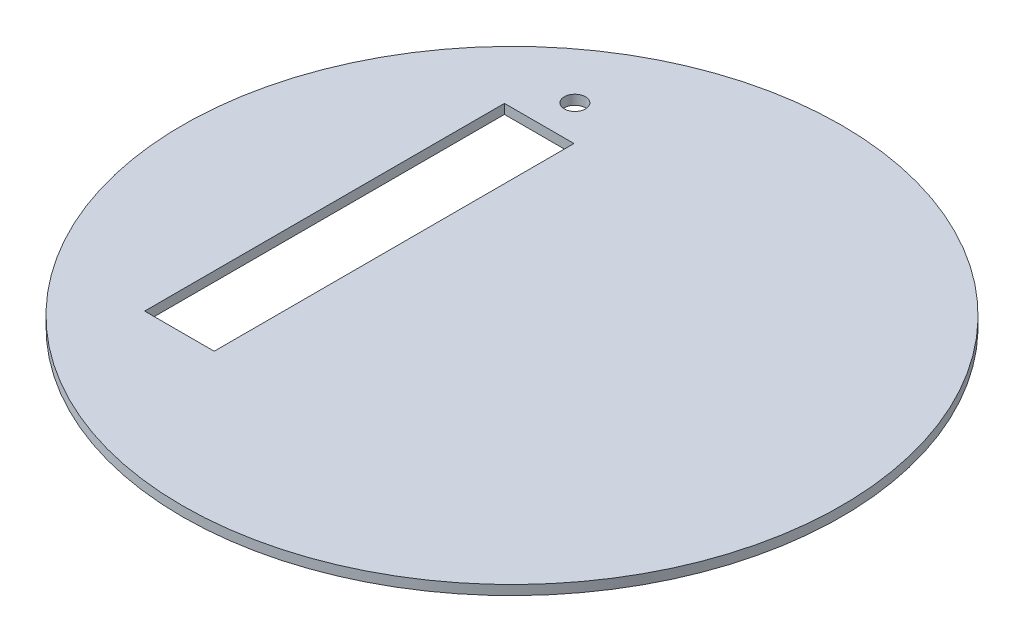
ISO-10303-21;
HEADER;
FILE_DESCRIPTION(('STEP AP214'),'2;1');
FILE_NAME('part.step','',(''),(''),'','','');
FILE_SCHEMA(('AUTOMOTIVE_DESIGN { 1 0 10303 214 1 1 1 1 }'));
ENDSEC;
DATA;
#1=APPLICATION_CONTEXT('core data for automotive mechanical design processes');
#2=APPLICATION_PROTOCOL_DEFINITION('international standard','automotive_design',2000,#1);
#3=PRODUCT_CONTEXT('',#1,'mechanical');
#4=PRODUCT('Part','Part','',(#3));
#5=PRODUCT_RELATED_PRODUCT_CATEGORY('part','',(#4));
#6=PRODUCT_DEFINITION_FORMATION('','',#4);
#7=PRODUCT_DEFINITION_CONTEXT('part definition',#1,'design');
#8=PRODUCT_DEFINITION('design','',#6,#7);
#9=PRODUCT_DEFINITION_SHAPE('','',#8);
#10=(LENGTH_UNIT() NAMED_UNIT(*) SI_UNIT(.MILLI.,.METRE.));
#11=(NAMED_UNIT(*) PLANE_ANGLE_UNIT() SI_UNIT($,.RADIAN.));
#12=(NAMED_UNIT(*) SI_UNIT($,.STERADIAN.) SOLID_ANGLE_UNIT());
#13=UNCERTAINTY_MEASURE_WITH_UNIT(LENGTH_MEASURE(1.E-05),#10,'distance_accuracy_value','');
#14=(GEOMETRIC_REPRESENTATION_CONTEXT(3) GLOBAL_UNCERTAINTY_ASSIGNED_CONTEXT((#13)) GLOBAL_UNIT_ASSIGNED_CONTEXT((#10,
#11,#12)) REPRESENTATION_CONTEXT('',''));
#15=CARTESIAN_POINT('',(0.,0.,0.));
#16=DIRECTION('',(0.,0.,1.));
#17=DIRECTION('',(1.,0.,0.));
#18=AXIS2_PLACEMENT_3D('',#15,#16,#17);
#19=CARTESIAN_POINT('',(0.,3.18,0.));
#20=DIRECTION('',(0.,1.,0.));
#21=DIRECTION('',(0.,0.,1.));
#22=AXIS2_PLACEMENT_3D('',#19,#20,#21);
#23=PLANE('',#22);
#24=CARTESIAN_POINT('',(-50.5,3.18,-71.3022378857318));
#25=DIRECTION('',(0.,1.,0.));
#26=DIRECTION('',(0.,0.,1.));
#27=AXIS2_PLACEMENT_3D('',#24,#25,#26);
#28=CIRCLE('',#27,3.5);
#29=CARTESIAN_POINT('',(-50.5,3.18,-67.8022378857318));
#30=VERTEX_POINT('',#29);
#31=EDGE_CURVE('E101',#30,#30,#28,.T.);
#32=ORIENTED_EDGE('',*,*,#31,.F.);
#33=EDGE_LOOP('',(#32));
#34=FACE_BOUND('',#33,.T.);
#35=DIRECTION('',(0.,0.,1.));
#36=VECTOR('',#35,1.);
#37=CARTESIAN_POINT('',(-62.,3.18,59.5));
#38=LINE('',#37,#36);
#39=CARTESIAN_POINT('',(-62.,3.18,-59.5));
#40=VERTEX_POINT('',#39);
#41=CARTESIAN_POINT('',(-62.,3.18,59.5));
#42=VERTEX_POINT('',#41);
#43=EDGE_CURVE('E51',#40,#42,#38,.T.);
#44=ORIENTED_EDGE('',*,*,#43,.F.);
#45=DIRECTION('',(-1.,0.,0.));
#46=VECTOR('',#45,1.);
#47=CARTESIAN_POINT('',(-39.,3.18,-59.5));
#48=LINE('',#47,#46);
#49=CARTESIAN_POINT('',(-39.,3.18,-59.5));
#50=VERTEX_POINT('',#49);
#51=EDGE_CURVE('E95',#50,#40,#48,.T.);
#52=ORIENTED_EDGE('',*,*,#51,.F.);
#53=DIRECTION('',(0.,0.,-1.));
#54=VECTOR('',#53,1.);
#55=CARTESIAN_POINT('',(-39.,3.18,59.5));
#56=LINE('',#55,#54);
#57=CARTESIAN_POINT('',(-39.,3.18,59.5));
#58=VERTEX_POINT('',#57);
#59=EDGE_CURVE('E98',#58,#50,#56,.T.);
#60=ORIENTED_EDGE('',*,*,#59,.F.);
#61=DIRECTION('',(1.,0.,0.));
#62=VECTOR('',#61,1.);
#63=CARTESIAN_POINT('',(-39.,3.18,59.5));
#64=LINE('',#63,#62);
#65=EDGE_CURVE('E107',#42,#58,#64,.T.);
#66=ORIENTED_EDGE('',*,*,#65,.F.);
#67=EDGE_LOOP('',(#44,#52,#60,#66));
#68=FACE_BOUND('',#67,.T.);
#69=CARTESIAN_POINT('',(0.,3.18,0.));
#70=DIRECTION('',(0.,-1.,0.));
#71=DIRECTION('',(0.,0.,-1.));
#72=AXIS2_PLACEMENT_3D('',#69,#70,#71);
#73=CIRCLE('',#72,109.);
#74=CARTESIAN_POINT('',(0.,3.18,-109.));
#75=VERTEX_POINT('',#74);
#76=EDGE_CURVE('E11',#75,#75,#73,.T.);
#77=ORIENTED_EDGE('',*,*,#76,.F.);
#78=EDGE_LOOP('',(#77));
#79=FACE_BOUND('',#78,.T.);
#80=ADVANCED_FACE('F37',(#34,#68,#79),#23,.T.);
#81=CARTESIAN_POINT('',(0.,4.51102530553271,0.));
#82=DIRECTION('',(0.,-1.,0.));
#83=DIRECTION('',(0.,0.,-1.));
#84=AXIS2_PLACEMENT_3D('',#81,#82,#83);
#85=CYLINDRICAL_SURFACE('',#84,109.);
#86=ORIENTED_EDGE('',*,*,#76,.T.);
#87=EDGE_LOOP('',(#86));
#88=FACE_BOUND('',#87,.T.);
#89=CARTESIAN_POINT('',(0.,0.,0.));
#90=DIRECTION('',(0.,-1.,0.));
#91=DIRECTION('',(0.,0.,-1.));
#92=AXIS2_PLACEMENT_3D('',#89,#90,#91);
#93=CIRCLE('',#92,109.);
#94=CARTESIAN_POINT('',(0.,0.,-109.));
#95=VERTEX_POINT('',#94);
#96=EDGE_CURVE('E44',#95,#95,#93,.T.);
#97=ORIENTED_EDGE('',*,*,#96,.F.);
#98=EDGE_LOOP('',(#97));
#99=FACE_BOUND('',#98,.T.);
#100=ADVANCED_FACE('F119',(#88,#99),#85,.T.);
#101=CARTESIAN_POINT('',(109.,0.,0.));
#102=DIRECTION('',(0.,-1.,0.));
#103=DIRECTION('',(0.,0.,-1.));
#104=AXIS2_PLACEMENT_3D('',#101,#102,#103);
#105=PLANE('',#104);
#106=CARTESIAN_POINT('',(-50.5,0.,-71.3022378857318));
#107=DIRECTION('',(0.,1.,0.));
#108=DIRECTION('',(0.,0.,1.));
#109=AXIS2_PLACEMENT_3D('',#106,#107,#108);
#110=CIRCLE('',#109,3.5);
#111=CARTESIAN_POINT('',(-50.5,0.,-67.8022378857318));
#112=VERTEX_POINT('',#111);
#113=EDGE_CURVE('E108',#112,#112,#110,.T.);
#114=ORIENTED_EDGE('',*,*,#113,.T.);
#115=EDGE_LOOP('',(#114));
#116=FACE_BOUND('',#115,.T.);
#117=DIRECTION('',(0.,0.,1.));
#118=VECTOR('',#117,1.);
#119=CARTESIAN_POINT('',(-62.,0.,59.5));
#120=LINE('',#119,#118);
#121=CARTESIAN_POINT('',(-62.,0.,-59.5));
#122=VERTEX_POINT('',#121);
#123=CARTESIAN_POINT('',(-62.,0.,59.5));
#124=VERTEX_POINT('',#123);
#125=EDGE_CURVE('E79',#122,#124,#120,.T.);
#126=ORIENTED_EDGE('',*,*,#125,.T.);
#127=DIRECTION('',(1.,0.,0.));
#128=VECTOR('',#127,1.);
#129=CARTESIAN_POINT('',(-39.,0.,59.5));
#130=LINE('',#129,#128);
#131=CARTESIAN_POINT('',(-39.,0.,59.5));
#132=VERTEX_POINT('',#131);
#133=EDGE_CURVE('E88',#124,#132,#130,.T.);
#134=ORIENTED_EDGE('',*,*,#133,.T.);
#135=DIRECTION('',(0.,0.,-1.));
#136=VECTOR('',#135,1.);
#137=CARTESIAN_POINT('',(-39.,0.,59.5));
#138=LINE('',#137,#136);
#139=CARTESIAN_POINT('',(-39.,0.,-59.5));
#140=VERTEX_POINT('',#139);
#141=EDGE_CURVE('E59',#132,#140,#138,.T.);
#142=ORIENTED_EDGE('',*,*,#141,.T.);
#143=DIRECTION('',(-1.,0.,0.));
#144=VECTOR('',#143,1.);
#145=CARTESIAN_POINT('',(-39.,0.,-59.5));
#146=LINE('',#145,#144);
#147=EDGE_CURVE('E85',#140,#122,#146,.T.);
#148=ORIENTED_EDGE('',*,*,#147,.T.);
#149=EDGE_LOOP('',(#126,#134,#142,#148));
#150=FACE_BOUND('',#149,.T.);
#151=ORIENTED_EDGE('',*,*,#96,.T.);
#152=EDGE_LOOP('',(#151));
#153=FACE_BOUND('',#152,.T.);
#154=ADVANCED_FACE('F92',(#116,#150,#153),#105,.T.);
#155=CARTESIAN_POINT('',(-62.,0.,59.5));
#156=DIRECTION('',(-1.,0.,0.));
#157=DIRECTION('',(0.,0.,1.));
#158=AXIS2_PLACEMENT_3D('',#155,#156,#157);
#159=PLANE('',#158);
#160=ORIENTED_EDGE('',*,*,#43,.T.);
#161=DIRECTION('',(0.,1.,0.));
#162=VECTOR('',#161,1.);
#163=CARTESIAN_POINT('',(-62.,0.,59.5));
#164=LINE('',#163,#162);
#165=EDGE_CURVE('E75',#124,#42,#164,.T.);
#166=ORIENTED_EDGE('',*,*,#165,.F.);
#167=ORIENTED_EDGE('',*,*,#125,.F.);
#168=DIRECTION('',(0.,1.,0.));
#169=VECTOR('',#168,1.);
#170=CARTESIAN_POINT('',(-62.,0.,-59.5));
#171=LINE('',#170,#169);
#172=EDGE_CURVE('E112',#122,#40,#171,.T.);
#173=ORIENTED_EDGE('',*,*,#172,.T.);
#174=EDGE_LOOP('',(#160,#166,#167,#173));
#175=FACE_BOUND('',#174,.T.);
#176=ADVANCED_FACE('F77',(#175),#159,.F.);
#177=CARTESIAN_POINT('',(-39.,0.,-59.5));
#178=DIRECTION('',(0.,0.,-1.));
#179=DIRECTION('',(-1.,0.,0.));
#180=AXIS2_PLACEMENT_3D('',#177,#178,#179);
#181=PLANE('',#180);
#182=ORIENTED_EDGE('',*,*,#51,.T.);
#183=ORIENTED_EDGE('',*,*,#172,.F.);
#184=ORIENTED_EDGE('',*,*,#147,.F.);
#185=DIRECTION('',(0.,1.,0.));
#186=VECTOR('',#185,1.);
#187=CARTESIAN_POINT('',(-39.,0.,-59.5));
#188=LINE('',#187,#186);
#189=EDGE_CURVE('E114',#140,#50,#188,.T.);
#190=ORIENTED_EDGE('',*,*,#189,.T.);
#191=EDGE_LOOP('',(#182,#183,#184,#190));
#192=FACE_BOUND('',#191,.T.);
#193=ADVANCED_FACE('F132',(#192),#181,.F.);
#194=CARTESIAN_POINT('',(-39.,0.,59.5));
#195=DIRECTION('',(1.,0.,0.));
#196=DIRECTION('',(0.,0.,-1.));
#197=AXIS2_PLACEMENT_3D('',#194,#195,#196);
#198=PLANE('',#197);
#199=ORIENTED_EDGE('',*,*,#59,.T.);
#200=ORIENTED_EDGE('',*,*,#189,.F.);
#201=ORIENTED_EDGE('',*,*,#141,.F.);
#202=DIRECTION('',(0.,1.,0.));
#203=VECTOR('',#202,1.);
#204=CARTESIAN_POINT('',(-39.,0.,59.5));
#205=LINE('',#204,#203);
#206=EDGE_CURVE('E84',#132,#58,#205,.T.);
#207=ORIENTED_EDGE('',*,*,#206,.T.);
#208=EDGE_LOOP('',(#199,#200,#201,#207));
#209=FACE_BOUND('',#208,.T.);
#210=ADVANCED_FACE('F136',(#209),#198,.F.);
#211=CARTESIAN_POINT('',(-39.,0.,59.5));
#212=DIRECTION('',(0.,0.,1.));
#213=DIRECTION('',(1.,0.,0.));
#214=AXIS2_PLACEMENT_3D('',#211,#212,#213);
#215=PLANE('',#214);
#216=ORIENTED_EDGE('',*,*,#65,.T.);
#217=ORIENTED_EDGE('',*,*,#206,.F.);
#218=ORIENTED_EDGE('',*,*,#133,.F.);
#219=ORIENTED_EDGE('',*,*,#165,.T.);
#220=EDGE_LOOP('',(#216,#217,#218,#219));
#221=FACE_BOUND('',#220,.T.);
#222=ADVANCED_FACE('F89',(#221),#215,.F.);
#223=CARTESIAN_POINT('',(-50.5,0.,-71.3022378857318));
#224=DIRECTION('',(0.,1.,0.));
#225=DIRECTION('',(0.,0.,1.));
#226=AXIS2_PLACEMENT_3D('',#223,#224,#225);
#227=CYLINDRICAL_SURFACE('',#226,3.5);
#228=CARTESIAN_POINT('',(-50.5,0.,-67.8022378857318));
#229=CARTESIAN_POINT('',(-50.5,0.033125,-67.8022378857318));
#230=CARTESIAN_POINT('',(-50.5,0.06625,-67.8022378857318));
#231=CARTESIAN_POINT('',(-50.5,0.1325,-67.8022378857318));
#232=CARTESIAN_POINT('',(-50.5,0.165625,-67.8022378857318));
#233=CARTESIAN_POINT('',(-50.5,0.231875,-67.8022378857318));
#234=CARTESIAN_POINT('',(-50.5,0.265,-67.8022378857318));
#235=CARTESIAN_POINT('',(-50.5,0.33125,-67.8022378857318));
#236=CARTESIAN_POINT('',(-50.5,0.364375,-67.8022378857318));
#237=CARTESIAN_POINT('',(-50.5,0.430625,-67.8022378857318));
#238=CARTESIAN_POINT('',(-50.5,0.46375,-67.8022378857318));
#239=CARTESIAN_POINT('',(-50.5,0.53,-67.8022378857318));
#240=CARTESIAN_POINT('',(-50.5,0.563125,-67.8022378857318));
#241=CARTESIAN_POINT('',(-50.5,0.629375,-67.8022378857318));
#242=CARTESIAN_POINT('',(-50.5,0.6625,-67.8022378857318));
#243=CARTESIAN_POINT('',(-50.5,0.72875,-67.8022378857318));
#244=CARTESIAN_POINT('',(-50.5,0.761875,-67.8022378857318));
#245=CARTESIAN_POINT('',(-50.5,0.828125,-67.8022378857318));
#246=CARTESIAN_POINT('',(-50.5,0.86125,-67.8022378857318));
#247=CARTESIAN_POINT('',(-50.5,0.9275,-67.8022378857318));
#248=CARTESIAN_POINT('',(-50.5,0.960625,-67.8022378857318));
#249=CARTESIAN_POINT('',(-50.5,1.026875,-67.8022378857318));
#250=CARTESIAN_POINT('',(-50.5,1.06,-67.8022378857318));
#251=CARTESIAN_POINT('',(-50.5,1.12625,-67.8022378857318));
#252=CARTESIAN_POINT('',(-50.5,1.159375,-67.8022378857318));
#253=CARTESIAN_POINT('',(-50.5,1.225625,-67.8022378857318));
#254=CARTESIAN_POINT('',(-50.5,1.25875,-67.8022378857318));
#255=CARTESIAN_POINT('',(-50.5,1.325,-67.8022378857318));
#256=CARTESIAN_POINT('',(-50.5,1.358125,-67.8022378857318));
#257=CARTESIAN_POINT('',(-50.5,1.424375,-67.8022378857318));
#258=CARTESIAN_POINT('',(-50.5,1.4575,-67.8022378857318));
#259=CARTESIAN_POINT('',(-50.5,1.52375,-67.8022378857318));
#260=CARTESIAN_POINT('',(-50.5,1.556875,-67.8022378857318));
#261=CARTESIAN_POINT('',(-50.5,1.623125,-67.8022378857318));
#262=CARTESIAN_POINT('',(-50.5,1.65625,-67.8022378857318));
#263=CARTESIAN_POINT('',(-50.5,1.7225,-67.8022378857318));
#264=CARTESIAN_POINT('',(-50.5,1.755625,-67.8022378857318));
#265=CARTESIAN_POINT('',(-50.5,1.821875,-67.8022378857318));
#266=CARTESIAN_POINT('',(-50.5,1.855,-67.8022378857318));
#267=CARTESIAN_POINT('',(-50.5,1.92125,-67.8022378857318));
#268=CARTESIAN_POINT('',(-50.5,1.954375,-67.8022378857318));
#269=CARTESIAN_POINT('',(-50.5,2.020625,-67.8022378857318));
#270=CARTESIAN_POINT('',(-50.5,2.05375,-67.8022378857318));
#271=CARTESIAN_POINT('',(-50.5,2.12,-67.8022378857318));
#272=CARTESIAN_POINT('',(-50.5,2.153125,-67.8022378857318));
#273=CARTESIAN_POINT('',(-50.5,2.219375,-67.8022378857318));
#274=CARTESIAN_POINT('',(-50.5,2.2525,-67.8022378857318));
#275=CARTESIAN_POINT('',(-50.5,2.31875,-67.8022378857318));
#276=CARTESIAN_POINT('',(-50.5,2.351875,-67.8022378857318));
#277=CARTESIAN_POINT('',(-50.5,2.418125,-67.8022378857318));
#278=CARTESIAN_POINT('',(-50.5,2.45125,-67.8022378857318));
#279=CARTESIAN_POINT('',(-50.5,2.5175,-67.8022378857318));
#280=CARTESIAN_POINT('',(-50.5,2.550625,-67.8022378857318));
#281=CARTESIAN_POINT('',(-50.5,2.616875,-67.8022378857318));
#282=CARTESIAN_POINT('',(-50.5,2.65,-67.8022378857318));
#283=CARTESIAN_POINT('',(-50.5,2.71625,-67.8022378857318));
#284=CARTESIAN_POINT('',(-50.5,2.749375,-67.8022378857318));
#285=CARTESIAN_POINT('',(-50.5,2.815625,-67.8022378857318));
#286=CARTESIAN_POINT('',(-50.5,2.84875,-67.8022378857318));
#287=CARTESIAN_POINT('',(-50.5,2.915,-67.8022378857318));
#288=CARTESIAN_POINT('',(-50.5,2.948125,-67.8022378857318));
#289=CARTESIAN_POINT('',(-50.5,3.014375,-67.8022378857318));
#290=CARTESIAN_POINT('',(-50.5,3.0475,-67.8022378857318));
#291=CARTESIAN_POINT('',(-50.5,3.11375,-67.8022378857318));
#292=CARTESIAN_POINT('',(-50.5,3.146875,-67.8022378857318));
#293=CARTESIAN_POINT('',(-50.5,3.18,-67.8022378857318));
#294=B_SPLINE_CURVE_WITH_KNOTS('',3,(#228,#229,#230,#231,#232,#233,#234,#235,#236,#237,#238,
#239,#240,#241,#242,#243,#244,#245,#246,#247,#248,#249,#250,#251,#252,#253,#254,#255,#256,#257,
#258,#259,#260,#261,#262,#263,#264,#265,#266,#267,#268,#269,#270,#271,#272,#273,#274,#275,#276,
#277,#278,#279,#280,#281,#282,#283,#284,#285,#286,#287,#288,#289,#290,#291,#292,#293),
.UNSPECIFIED.,.F.,.F.,(4,2,2,2,2,2,2,2,2,2,2,2,2,2,2,2,2,2,2,2,2,2,2,2,2,2,2,2,2,2,2,2,4),(0.,
0.099375,0.19875,0.298125,0.3975,0.496875,0.59625,0.695625,0.795,0.894375,0.99375,1.093125,
1.1925,1.291875,1.39125,1.490625,1.59,1.689375,1.78875,1.888125,1.9875,2.086875,2.18625,
2.285625,2.385,2.484375,2.58375,2.683125,2.7825,2.881875,2.98125,3.080625,3.18),.UNSPECIFIED.);
#295=EDGE_CURVE('BSEAM135',#112,#30,#294,.T.);
#296=ORIENTED_EDGE('',*,*,#113,.F.);
#297=ORIENTED_EDGE('',*,*,#31,.T.);
#298=ORIENTED_EDGE('',*,*,#295,.T.);
#299=ORIENTED_EDGE('',*,*,#295,.F.);
#300=EDGE_LOOP('',(#296,#298,#297,#299));
#301=FACE_BOUND('',#300,.T.);
#302=ADVANCED_FACE('F135',(#301),#227,.F.);
#303=CLOSED_SHELL('',(#80,#100,#154,#176,#193,#210,#222,#302));
#304=MANIFOLD_SOLID_BREP('B2',#303);
#305=ADVANCED_BREP_SHAPE_REPRESENTATION('',(#18,#304),#14);
#306=SHAPE_DEFINITION_REPRESENTATION(#9,#305);
ENDSEC;
END-ISO-10303-21;
